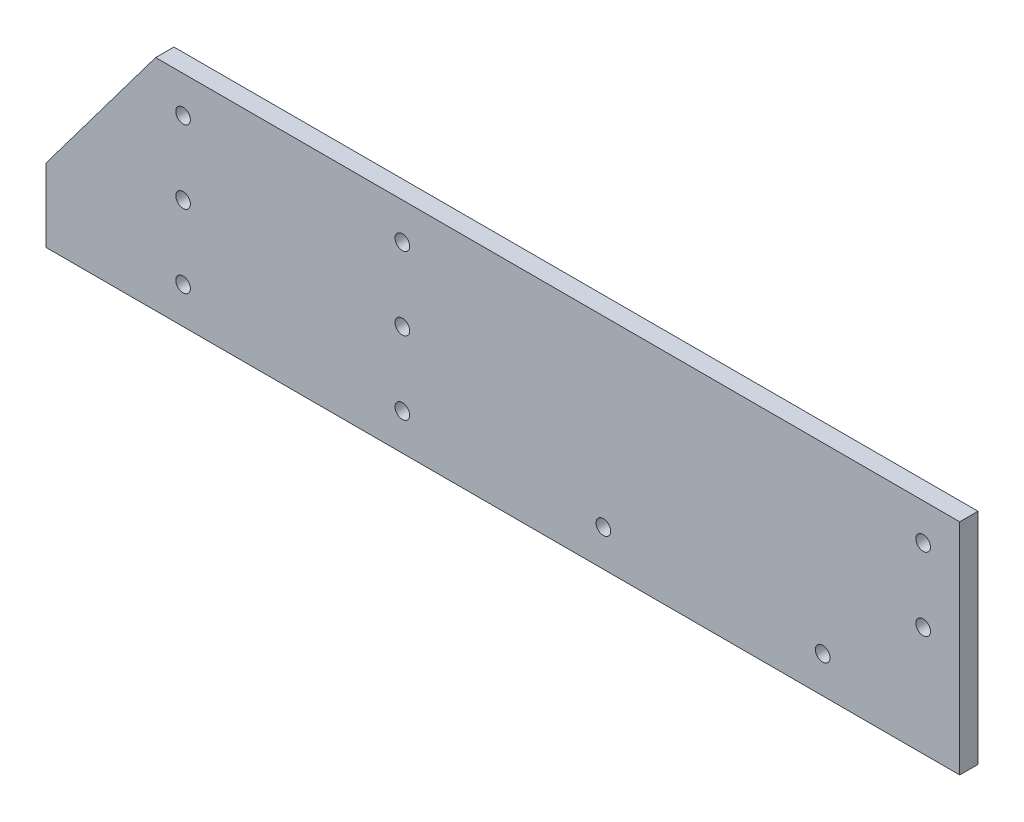
ISO-10303-21;
HEADER;
FILE_DESCRIPTION(('STEP AP214'),'2;1');
FILE_NAME('part.step','',(''),(''),'','','');
FILE_SCHEMA(('AUTOMOTIVE_DESIGN { 1 0 10303 214 1 1 1 1 }'));
ENDSEC;
DATA;
#1=APPLICATION_CONTEXT('core data for automotive mechanical design processes');
#2=APPLICATION_PROTOCOL_DEFINITION('international standard','automotive_design',2000,#1);
#3=PRODUCT_CONTEXT('',#1,'mechanical');
#4=PRODUCT('Part','Part','',(#3));
#5=PRODUCT_RELATED_PRODUCT_CATEGORY('part','',(#4));
#6=PRODUCT_DEFINITION_FORMATION('','',#4);
#7=PRODUCT_DEFINITION_CONTEXT('part definition',#1,'design');
#8=PRODUCT_DEFINITION('design','',#6,#7);
#9=PRODUCT_DEFINITION_SHAPE('','',#8);
#10=(LENGTH_UNIT() NAMED_UNIT(*) SI_UNIT(.MILLI.,.METRE.));
#11=(NAMED_UNIT(*) PLANE_ANGLE_UNIT() SI_UNIT($,.RADIAN.));
#12=(NAMED_UNIT(*) SI_UNIT($,.STERADIAN.) SOLID_ANGLE_UNIT());
#13=UNCERTAINTY_MEASURE_WITH_UNIT(LENGTH_MEASURE(1.E-05),#10,'distance_accuracy_value','');
#14=(GEOMETRIC_REPRESENTATION_CONTEXT(3) GLOBAL_UNCERTAINTY_ASSIGNED_CONTEXT((#13)) GLOBAL_UNIT_ASSIGNED_CONTEXT((#10,
#11,#12)) REPRESENTATION_CONTEXT('',''));
#15=CARTESIAN_POINT('',(0.,0.,0.));
#16=DIRECTION('',(0.,0.,1.));
#17=DIRECTION('',(1.,0.,0.));
#18=AXIS2_PLACEMENT_3D('',#15,#16,#17);
#19=CARTESIAN_POINT('',(0.,0.,5.));
#20=DIRECTION('',(1.,0.,0.));
#21=DIRECTION('',(0.,0.,-1.));
#22=AXIS2_PLACEMENT_3D('',#19,#20,#21);
#23=PLANE('',#22);
#24=DIRECTION('',(0.,-1.,0.));
#25=VECTOR('',#24,1.);
#26=CARTESIAN_POINT('',(0.,0.,5.));
#27=LINE('',#26,#25);
#28=CARTESIAN_POINT('',(0.,20.,5.));
#29=VERTEX_POINT('',#28);
#30=CARTESIAN_POINT('',(0.,0.,5.));
#31=VERTEX_POINT('',#30);
#32=EDGE_CURVE('E78',#29,#31,#27,.T.);
#33=ORIENTED_EDGE('',*,*,#32,.F.);
#34=DIRECTION('',(0.,0.,1.));
#35=VECTOR('',#34,1.);
#36=CARTESIAN_POINT('',(0.,20.,0.));
#37=LINE('',#36,#35);
#38=CARTESIAN_POINT('',(0.,20.,0.));
#39=VERTEX_POINT('',#38);
#40=EDGE_CURVE('E89',#39,#29,#37,.T.);
#41=ORIENTED_EDGE('',*,*,#40,.F.);
#42=DIRECTION('',(0.,-1.,0.));
#43=VECTOR('',#42,1.);
#44=CARTESIAN_POINT('',(0.,0.,0.));
#45=LINE('',#44,#43);
#46=CARTESIAN_POINT('',(0.,0.,0.));
#47=VERTEX_POINT('',#46);
#48=EDGE_CURVE('E97',#39,#47,#45,.T.);
#49=ORIENTED_EDGE('',*,*,#48,.T.);
#50=DIRECTION('',(0.,0.,-1.));
#51=VECTOR('',#50,1.);
#52=CARTESIAN_POINT('',(0.,0.,5.));
#53=LINE('',#52,#51);
#54=EDGE_CURVE('E11',#31,#47,#53,.T.);
#55=ORIENTED_EDGE('',*,*,#54,.F.);
#56=EDGE_LOOP('',(#33,#41,#49,#55));
#57=FACE_BOUND('',#56,.T.);
#58=ADVANCED_FACE('F33',(#57),#23,.F.);
#59=CARTESIAN_POINT('',(0.,0.,5.));
#60=DIRECTION('',(0.,1.,0.));
#61=DIRECTION('',(0.,0.,1.));
#62=AXIS2_PLACEMENT_3D('',#59,#60,#61);
#63=PLANE('',#62);
#64=DIRECTION('',(1.,0.,0.));
#65=VECTOR('',#64,1.);
#66=CARTESIAN_POINT('',(0.,0.,0.));
#67=LINE('',#66,#65);
#68=CARTESIAN_POINT('',(250.,0.,0.));
#69=VERTEX_POINT('',#68);
#70=EDGE_CURVE('E102',#47,#69,#67,.T.);
#71=ORIENTED_EDGE('',*,*,#70,.T.);
#72=DIRECTION('',(0.,0.,-1.));
#73=VECTOR('',#72,1.);
#74=CARTESIAN_POINT('',(250.,0.,5.));
#75=LINE('',#74,#73);
#76=CARTESIAN_POINT('',(250.,0.,5.));
#77=VERTEX_POINT('',#76);
#78=EDGE_CURVE('E40',#77,#69,#75,.T.);
#79=ORIENTED_EDGE('',*,*,#78,.F.);
#80=DIRECTION('',(1.,0.,0.));
#81=VECTOR('',#80,1.);
#82=CARTESIAN_POINT('',(0.,0.,5.));
#83=LINE('',#82,#81);
#84=EDGE_CURVE('E123',#31,#77,#83,.T.);
#85=ORIENTED_EDGE('',*,*,#84,.F.);
#86=ORIENTED_EDGE('',*,*,#54,.T.);
#87=EDGE_LOOP('',(#71,#79,#85,#86));
#88=FACE_BOUND('',#87,.T.);
#89=ADVANCED_FACE('F200',(#88),#63,.F.);
#90=CARTESIAN_POINT('',(250.,0.,5.));
#91=DIRECTION('',(-1.,0.,0.));
#92=DIRECTION('',(0.,0.,1.));
#93=AXIS2_PLACEMENT_3D('',#90,#91,#92);
#94=PLANE('',#93);
#95=DIRECTION('',(0.,1.,0.));
#96=VECTOR('',#95,1.);
#97=CARTESIAN_POINT('',(250.,0.,0.));
#98=LINE('',#97,#96);
#99=CARTESIAN_POINT('',(250.,60.,0.));
#100=VERTEX_POINT('',#99);
#101=EDGE_CURVE('E73',#69,#100,#98,.T.);
#102=ORIENTED_EDGE('',*,*,#101,.T.);
#103=DIRECTION('',(0.,0.,-1.));
#104=VECTOR('',#103,1.);
#105=CARTESIAN_POINT('',(250.,60.,5.));
#106=LINE('',#105,#104);
#107=CARTESIAN_POINT('',(250.,60.,5.));
#108=VERTEX_POINT('',#107);
#109=EDGE_CURVE('E116',#108,#100,#106,.T.);
#110=ORIENTED_EDGE('',*,*,#109,.F.);
#111=DIRECTION('',(0.,1.,0.));
#112=VECTOR('',#111,1.);
#113=CARTESIAN_POINT('',(250.,0.,5.));
#114=LINE('',#113,#112);
#115=EDGE_CURVE('E56',#77,#108,#114,.T.);
#116=ORIENTED_EDGE('',*,*,#115,.F.);
#117=ORIENTED_EDGE('',*,*,#78,.T.);
#118=EDGE_LOOP('',(#102,#110,#116,#117));
#119=FACE_BOUND('',#118,.T.);
#120=ADVANCED_FACE('F118',(#119),#94,.F.);
#121=CARTESIAN_POINT('',(0.,60.,5.));
#122=DIRECTION('',(0.,-1.,0.));
#123=DIRECTION('',(0.,0.,-1.));
#124=AXIS2_PLACEMENT_3D('',#121,#122,#123);
#125=PLANE('',#124);
#126=DIRECTION('',(-1.,0.,0.));
#127=VECTOR('',#126,1.);
#128=CARTESIAN_POINT('',(0.,60.,0.));
#129=LINE('',#128,#127);
#130=CARTESIAN_POINT('',(30.,60.,0.));
#131=VERTEX_POINT('',#130);
#132=EDGE_CURVE('E114',#100,#131,#129,.T.);
#133=ORIENTED_EDGE('',*,*,#132,.T.);
#134=DIRECTION('',(0.,0.,1.));
#135=VECTOR('',#134,1.);
#136=CARTESIAN_POINT('',(30.,60.,0.));
#137=LINE('',#136,#135);
#138=CARTESIAN_POINT('',(30.,60.,5.));
#139=VERTEX_POINT('',#138);
#140=EDGE_CURVE('E47',#131,#139,#137,.T.);
#141=ORIENTED_EDGE('',*,*,#140,.T.);
#142=DIRECTION('',(-1.,0.,0.));
#143=VECTOR('',#142,1.);
#144=CARTESIAN_POINT('',(0.,60.,5.));
#145=LINE('',#144,#143);
#146=EDGE_CURVE('E110',#108,#139,#145,.T.);
#147=ORIENTED_EDGE('',*,*,#146,.F.);
#148=ORIENTED_EDGE('',*,*,#109,.T.);
#149=EDGE_LOOP('',(#133,#141,#147,#148));
#150=FACE_BOUND('',#149,.T.);
#151=ADVANCED_FACE('F121',(#150),#125,.F.);
#152=CARTESIAN_POINT('',(0.,0.,5.));
#153=DIRECTION('',(0.,0.,-1.));
#154=DIRECTION('',(-1.,0.,0.));
#155=AXIS2_PLACEMENT_3D('',#152,#153,#154);
#156=PLANE('',#155);
#157=CARTESIAN_POINT('',(240.,30.,5.));
#158=DIRECTION('',(0.,0.,1.));
#159=DIRECTION('',(1.,0.,0.));
#160=AXIS2_PLACEMENT_3D('',#157,#158,#159);
#161=CIRCLE('',#160,2.);
#162=CARTESIAN_POINT('',(242.,30.,5.));
#163=VERTEX_POINT('',#162);
#164=EDGE_CURVE('E161',#163,#163,#161,.T.);
#165=ORIENTED_EDGE('',*,*,#164,.F.);
#166=EDGE_LOOP('',(#165));
#167=FACE_BOUND('',#166,.T.);
#168=CARTESIAN_POINT('',(37.5,30.,5.));
#169=DIRECTION('',(0.,0.,1.));
#170=DIRECTION('',(1.,0.,0.));
#171=AXIS2_PLACEMENT_3D('',#168,#169,#170);
#172=CIRCLE('',#171,2.);
#173=CARTESIAN_POINT('',(39.5,30.,5.));
#174=VERTEX_POINT('',#173);
#175=EDGE_CURVE('E154',#174,#174,#172,.T.);
#176=ORIENTED_EDGE('',*,*,#175,.F.);
#177=EDGE_LOOP('',(#176));
#178=FACE_BOUND('',#177,.T.);
#179=CARTESIAN_POINT('',(37.5,50.,5.));
#180=DIRECTION('',(0.,0.,1.));
#181=DIRECTION('',(1.,0.,0.));
#182=AXIS2_PLACEMENT_3D('',#179,#180,#181);
#183=CIRCLE('',#182,2.);
#184=CARTESIAN_POINT('',(39.5,50.,5.));
#185=VERTEX_POINT('',#184);
#186=EDGE_CURVE('E179',#185,#185,#183,.T.);
#187=ORIENTED_EDGE('',*,*,#186,.F.);
#188=EDGE_LOOP('',(#187));
#189=FACE_BOUND('',#188,.T.);
#190=CARTESIAN_POINT('',(97.5,50.,5.));
#191=DIRECTION('',(0.,0.,1.));
#192=DIRECTION('',(-1.,0.,0.));
#193=AXIS2_PLACEMENT_3D('',#190,#191,#192);
#194=CIRCLE('',#193,2.);
#195=CARTESIAN_POINT('',(95.5,50.,5.));
#196=VERTEX_POINT('',#195);
#197=EDGE_CURVE('E173',#196,#196,#194,.T.);
#198=ORIENTED_EDGE('',*,*,#197,.F.);
#199=EDGE_LOOP('',(#198));
#200=FACE_BOUND('',#199,.T.);
#201=CARTESIAN_POINT('',(97.5,30.,5.));
#202=DIRECTION('',(0.,0.,1.));
#203=DIRECTION('',(-1.,0.,0.));
#204=AXIS2_PLACEMENT_3D('',#201,#202,#203);
#205=CIRCLE('',#204,2.);
#206=CARTESIAN_POINT('',(95.5,30.,5.));
#207=VERTEX_POINT('',#206);
#208=EDGE_CURVE('E166',#207,#207,#205,.T.);
#209=ORIENTED_EDGE('',*,*,#208,.F.);
#210=EDGE_LOOP('',(#209));
#211=FACE_BOUND('',#210,.T.);
#212=CARTESIAN_POINT('',(240.,50.,5.));
#213=DIRECTION('',(0.,0.,1.));
#214=DIRECTION('',(1.,0.,0.));
#215=AXIS2_PLACEMENT_3D('',#212,#213,#214);
#216=CIRCLE('',#215,2.);
#217=CARTESIAN_POINT('',(242.,50.,5.));
#218=VERTEX_POINT('',#217);
#219=EDGE_CURVE('E130',#218,#218,#216,.T.);
#220=ORIENTED_EDGE('',*,*,#219,.F.);
#221=EDGE_LOOP('',(#220));
#222=FACE_BOUND('',#221,.T.);
#223=CARTESIAN_POINT('',(212.5,10.,5.));
#224=DIRECTION('',(0.,0.,1.));
#225=DIRECTION('',(-1.,0.,0.));
#226=AXIS2_PLACEMENT_3D('',#223,#224,#225);
#227=CIRCLE('',#226,2.);
#228=CARTESIAN_POINT('',(210.5,10.,5.));
#229=VERTEX_POINT('',#228);
#230=EDGE_CURVE('E137',#229,#229,#227,.T.);
#231=ORIENTED_EDGE('',*,*,#230,.F.);
#232=EDGE_LOOP('',(#231));
#233=FACE_BOUND('',#232,.T.);
#234=CARTESIAN_POINT('',(152.5,10.,5.));
#235=DIRECTION('',(0.,0.,1.));
#236=DIRECTION('',(-1.,0.,0.));
#237=AXIS2_PLACEMENT_3D('',#234,#235,#236);
#238=CIRCLE('',#237,2.);
#239=CARTESIAN_POINT('',(150.5,10.,5.));
#240=VERTEX_POINT('',#239);
#241=EDGE_CURVE('E143',#240,#240,#238,.T.);
#242=ORIENTED_EDGE('',*,*,#241,.F.);
#243=EDGE_LOOP('',(#242));
#244=FACE_BOUND('',#243,.T.);
#245=CARTESIAN_POINT('',(97.5,10.,5.));
#246=DIRECTION('',(0.,0.,1.));
#247=DIRECTION('',(1.,0.,0.));
#248=AXIS2_PLACEMENT_3D('',#245,#246,#247);
#249=CIRCLE('',#248,2.);
#250=CARTESIAN_POINT('',(99.5,10.,5.));
#251=VERTEX_POINT('',#250);
#252=EDGE_CURVE('E149',#251,#251,#249,.T.);
#253=ORIENTED_EDGE('',*,*,#252,.F.);
#254=EDGE_LOOP('',(#253));
#255=FACE_BOUND('',#254,.T.);
#256=CARTESIAN_POINT('',(37.5,10.,5.));
#257=DIRECTION('',(0.,0.,1.));
#258=DIRECTION('',(1.,0.,0.));
#259=AXIS2_PLACEMENT_3D('',#256,#257,#258);
#260=CIRCLE('',#259,2.);
#261=CARTESIAN_POINT('',(39.5,10.,5.));
#262=VERTEX_POINT('',#261);
#263=EDGE_CURVE('E107',#262,#262,#260,.T.);
#264=ORIENTED_EDGE('',*,*,#263,.F.);
#265=EDGE_LOOP('',(#264));
#266=FACE_BOUND('',#265,.T.);
#267=ORIENTED_EDGE('',*,*,#146,.T.);
#268=DIRECTION('',(-0.6,-0.8,0.));
#269=VECTOR('',#268,1.);
#270=CARTESIAN_POINT('',(-9.6,7.2,5.));
#271=LINE('',#270,#269);
#272=EDGE_CURVE('E170',#139,#29,#271,.T.);
#273=ORIENTED_EDGE('',*,*,#272,.T.);
#274=ORIENTED_EDGE('',*,*,#32,.T.);
#275=ORIENTED_EDGE('',*,*,#84,.T.);
#276=ORIENTED_EDGE('',*,*,#115,.T.);
#277=EDGE_LOOP('',(#267,#273,#274,#275,#276));
#278=FACE_BOUND('',#277,.T.);
#279=ADVANCED_FACE('F185',(#167,#178,#189,#200,#211,#222,#233,#244,#255,#266,#278),#156,.F.);
#280=CARTESIAN_POINT('',(0.,0.,0.));
#281=DIRECTION('',(0.,0.,-1.));
#282=DIRECTION('',(-1.,0.,0.));
#283=AXIS2_PLACEMENT_3D('',#280,#281,#282);
#284=PLANE('',#283);
#285=DIRECTION('',(0.6,0.8,0.));
#286=VECTOR('',#285,1.);
#287=CARTESIAN_POINT('',(0.,20.,0.));
#288=LINE('',#287,#286);
#289=EDGE_CURVE('E86',#39,#131,#288,.T.);
#290=ORIENTED_EDGE('',*,*,#289,.T.);
#291=ORIENTED_EDGE('',*,*,#132,.F.);
#292=ORIENTED_EDGE('',*,*,#101,.F.);
#293=ORIENTED_EDGE('',*,*,#70,.F.);
#294=ORIENTED_EDGE('',*,*,#48,.F.);
#295=EDGE_LOOP('',(#290,#291,#292,#293,#294));
#296=FACE_BOUND('',#295,.T.);
#297=CARTESIAN_POINT('',(240.,30.,0.));
#298=DIRECTION('',(0.,0.,1.));
#299=DIRECTION('',(1.,0.,0.));
#300=AXIS2_PLACEMENT_3D('',#297,#298,#299);
#301=CIRCLE('',#300,2.);
#302=CARTESIAN_POINT('',(242.,30.,0.));
#303=VERTEX_POINT('',#302);
#304=EDGE_CURVE('E134',#303,#303,#301,.T.);
#305=ORIENTED_EDGE('',*,*,#304,.T.);
#306=EDGE_LOOP('',(#305));
#307=FACE_BOUND('',#306,.T.);
#308=CARTESIAN_POINT('',(37.5,30.,0.));
#309=DIRECTION('',(0.,0.,1.));
#310=DIRECTION('',(1.,0.,0.));
#311=AXIS2_PLACEMENT_3D('',#308,#309,#310);
#312=CIRCLE('',#311,2.);
#313=CARTESIAN_POINT('',(39.5,30.,0.));
#314=VERTEX_POINT('',#313);
#315=EDGE_CURVE('E157',#314,#314,#312,.T.);
#316=ORIENTED_EDGE('',*,*,#315,.T.);
#317=EDGE_LOOP('',(#316));
#318=FACE_BOUND('',#317,.T.);
#319=CARTESIAN_POINT('',(37.5,50.,0.));
#320=DIRECTION('',(0.,0.,1.));
#321=DIRECTION('',(1.,0.,0.));
#322=AXIS2_PLACEMENT_3D('',#319,#320,#321);
#323=CIRCLE('',#322,2.);
#324=CARTESIAN_POINT('',(39.5,50.,0.));
#325=VERTEX_POINT('',#324);
#326=EDGE_CURVE('E158',#325,#325,#323,.T.);
#327=ORIENTED_EDGE('',*,*,#326,.T.);
#328=EDGE_LOOP('',(#327));
#329=FACE_BOUND('',#328,.T.);
#330=CARTESIAN_POINT('',(97.5,50.,0.));
#331=DIRECTION('',(0.,0.,1.));
#332=DIRECTION('',(-1.,0.,0.));
#333=AXIS2_PLACEMENT_3D('',#330,#331,#332);
#334=CIRCLE('',#333,2.);
#335=CARTESIAN_POINT('',(95.5,50.,0.));
#336=VERTEX_POINT('',#335);
#337=EDGE_CURVE('E176',#336,#336,#334,.T.);
#338=ORIENTED_EDGE('',*,*,#337,.T.);
#339=EDGE_LOOP('',(#338));
#340=FACE_BOUND('',#339,.T.);
#341=CARTESIAN_POINT('',(97.5,30.,0.));
#342=DIRECTION('',(0.,0.,1.));
#343=DIRECTION('',(-1.,0.,0.));
#344=AXIS2_PLACEMENT_3D('',#341,#342,#343);
#345=CIRCLE('',#344,2.);
#346=CARTESIAN_POINT('',(95.5,30.,0.));
#347=VERTEX_POINT('',#346);
#348=EDGE_CURVE('E169',#347,#347,#345,.T.);
#349=ORIENTED_EDGE('',*,*,#348,.T.);
#350=EDGE_LOOP('',(#349));
#351=FACE_BOUND('',#350,.T.);
#352=CARTESIAN_POINT('',(240.,50.,0.));
#353=DIRECTION('',(0.,0.,1.));
#354=DIRECTION('',(1.,0.,0.));
#355=AXIS2_PLACEMENT_3D('',#352,#353,#354);
#356=CIRCLE('',#355,2.);
#357=CARTESIAN_POINT('',(242.,50.,0.));
#358=VERTEX_POINT('',#357);
#359=EDGE_CURVE('E133',#358,#358,#356,.T.);
#360=ORIENTED_EDGE('',*,*,#359,.T.);
#361=EDGE_LOOP('',(#360));
#362=FACE_BOUND('',#361,.T.);
#363=CARTESIAN_POINT('',(212.5,10.,0.));
#364=DIRECTION('',(0.,0.,1.));
#365=DIRECTION('',(-1.,0.,0.));
#366=AXIS2_PLACEMENT_3D('',#363,#364,#365);
#367=CIRCLE('',#366,2.);
#368=CARTESIAN_POINT('',(210.5,10.,0.));
#369=VERTEX_POINT('',#368);
#370=EDGE_CURVE('E140',#369,#369,#367,.T.);
#371=ORIENTED_EDGE('',*,*,#370,.T.);
#372=EDGE_LOOP('',(#371));
#373=FACE_BOUND('',#372,.T.);
#374=CARTESIAN_POINT('',(152.5,10.,0.));
#375=DIRECTION('',(0.,0.,1.));
#376=DIRECTION('',(-1.,0.,0.));
#377=AXIS2_PLACEMENT_3D('',#374,#375,#376);
#378=CIRCLE('',#377,2.);
#379=CARTESIAN_POINT('',(150.5,10.,0.));
#380=VERTEX_POINT('',#379);
#381=EDGE_CURVE('E146',#380,#380,#378,.T.);
#382=ORIENTED_EDGE('',*,*,#381,.T.);
#383=EDGE_LOOP('',(#382));
#384=FACE_BOUND('',#383,.T.);
#385=CARTESIAN_POINT('',(97.5,10.,0.));
#386=DIRECTION('',(0.,0.,1.));
#387=DIRECTION('',(1.,0.,0.));
#388=AXIS2_PLACEMENT_3D('',#385,#386,#387);
#389=CIRCLE('',#388,2.);
#390=CARTESIAN_POINT('',(99.5,10.,0.));
#391=VERTEX_POINT('',#390);
#392=EDGE_CURVE('E128',#391,#391,#389,.T.);
#393=ORIENTED_EDGE('',*,*,#392,.T.);
#394=EDGE_LOOP('',(#393));
#395=FACE_BOUND('',#394,.T.);
#396=CARTESIAN_POINT('',(37.5,10.,0.));
#397=DIRECTION('',(0.,0.,1.));
#398=DIRECTION('',(1.,0.,0.));
#399=AXIS2_PLACEMENT_3D('',#396,#397,#398);
#400=CIRCLE('',#399,2.);
#401=CARTESIAN_POINT('',(39.5,10.,0.));
#402=VERTEX_POINT('',#401);
#403=EDGE_CURVE('E103',#402,#402,#400,.T.);
#404=ORIENTED_EDGE('',*,*,#403,.T.);
#405=EDGE_LOOP('',(#404));
#406=FACE_BOUND('',#405,.T.);
#407=ADVANCED_FACE('F100',(#296,#307,#318,#329,#340,#351,#362,#373,#384,#395,#406),#284,.T.);
#408=CARTESIAN_POINT('',(37.5,10.,0.));
#409=DIRECTION('',(0.,0.,1.));
#410=DIRECTION('',(1.,0.,0.));
#411=AXIS2_PLACEMENT_3D('',#408,#409,#410);
#412=CYLINDRICAL_SURFACE('',#411,2.);
#413=ORIENTED_EDGE('',*,*,#403,.F.);
#414=EDGE_LOOP('',(#413));
#415=FACE_BOUND('',#414,.T.);
#416=ORIENTED_EDGE('',*,*,#263,.T.);
#417=EDGE_LOOP('',(#416));
#418=FACE_BOUND('',#417,.T.);
#419=ADVANCED_FACE('F193',(#415,#418),#412,.F.);
#420=CARTESIAN_POINT('',(97.5,10.,0.));
#421=DIRECTION('',(0.,0.,1.));
#422=DIRECTION('',(1.,0.,0.));
#423=AXIS2_PLACEMENT_3D('',#420,#421,#422);
#424=CYLINDRICAL_SURFACE('',#423,2.);
#425=ORIENTED_EDGE('',*,*,#392,.F.);
#426=EDGE_LOOP('',(#425));
#427=FACE_BOUND('',#426,.T.);
#428=ORIENTED_EDGE('',*,*,#252,.T.);
#429=EDGE_LOOP('',(#428));
#430=FACE_BOUND('',#429,.T.);
#431=ADVANCED_FACE('F302',(#427,#430),#424,.F.);
#432=CARTESIAN_POINT('',(152.5,10.,0.));
#433=DIRECTION('',(0.,0.,1.));
#434=DIRECTION('',(1.,0.,0.));
#435=AXIS2_PLACEMENT_3D('',#432,#433,#434);
#436=CYLINDRICAL_SURFACE('',#435,2.);
#437=ORIENTED_EDGE('',*,*,#381,.F.);
#438=EDGE_LOOP('',(#437));
#439=FACE_BOUND('',#438,.T.);
#440=ORIENTED_EDGE('',*,*,#241,.T.);
#441=EDGE_LOOP('',(#440));
#442=FACE_BOUND('',#441,.T.);
#443=ADVANCED_FACE('F294',(#439,#442),#436,.F.);
#444=CARTESIAN_POINT('',(212.5,10.,0.));
#445=DIRECTION('',(0.,0.,1.));
#446=DIRECTION('',(1.,0.,0.));
#447=AXIS2_PLACEMENT_3D('',#444,#445,#446);
#448=CYLINDRICAL_SURFACE('',#447,2.);
#449=ORIENTED_EDGE('',*,*,#370,.F.);
#450=EDGE_LOOP('',(#449));
#451=FACE_BOUND('',#450,.T.);
#452=ORIENTED_EDGE('',*,*,#230,.T.);
#453=EDGE_LOOP('',(#452));
#454=FACE_BOUND('',#453,.T.);
#455=ADVANCED_FACE('F286',(#451,#454),#448,.F.);
#456=CARTESIAN_POINT('',(240.,50.,0.));
#457=DIRECTION('',(0.,0.,1.));
#458=DIRECTION('',(1.,0.,0.));
#459=AXIS2_PLACEMENT_3D('',#456,#457,#458);
#460=CYLINDRICAL_SURFACE('',#459,2.);
#461=ORIENTED_EDGE('',*,*,#359,.F.);
#462=EDGE_LOOP('',(#461));
#463=FACE_BOUND('',#462,.T.);
#464=ORIENTED_EDGE('',*,*,#219,.T.);
#465=EDGE_LOOP('',(#464));
#466=FACE_BOUND('',#465,.T.);
#467=ADVANCED_FACE('F278',(#463,#466),#460,.F.);
#468=CARTESIAN_POINT('',(97.5,30.,0.));
#469=DIRECTION('',(0.,0.,1.));
#470=DIRECTION('',(1.,0.,0.));
#471=AXIS2_PLACEMENT_3D('',#468,#469,#470);
#472=CYLINDRICAL_SURFACE('',#471,2.);
#473=ORIENTED_EDGE('',*,*,#348,.F.);
#474=EDGE_LOOP('',(#473));
#475=FACE_BOUND('',#474,.T.);
#476=ORIENTED_EDGE('',*,*,#208,.T.);
#477=EDGE_LOOP('',(#476));
#478=FACE_BOUND('',#477,.T.);
#479=ADVANCED_FACE('F270',(#475,#478),#472,.F.);
#480=CARTESIAN_POINT('',(97.5,50.,0.));
#481=DIRECTION('',(0.,0.,1.));
#482=DIRECTION('',(1.,0.,0.));
#483=AXIS2_PLACEMENT_3D('',#480,#481,#482);
#484=CYLINDRICAL_SURFACE('',#483,2.);
#485=ORIENTED_EDGE('',*,*,#337,.F.);
#486=EDGE_LOOP('',(#485));
#487=FACE_BOUND('',#486,.T.);
#488=ORIENTED_EDGE('',*,*,#197,.T.);
#489=EDGE_LOOP('',(#488));
#490=FACE_BOUND('',#489,.T.);
#491=ADVANCED_FACE('F262',(#487,#490),#484,.F.);
#492=CARTESIAN_POINT('',(37.5,50.,0.));
#493=DIRECTION('',(0.,0.,1.));
#494=DIRECTION('',(1.,0.,0.));
#495=AXIS2_PLACEMENT_3D('',#492,#493,#494);
#496=CYLINDRICAL_SURFACE('',#495,2.);
#497=ORIENTED_EDGE('',*,*,#326,.F.);
#498=EDGE_LOOP('',(#497));
#499=FACE_BOUND('',#498,.T.);
#500=ORIENTED_EDGE('',*,*,#186,.T.);
#501=EDGE_LOOP('',(#500));
#502=FACE_BOUND('',#501,.T.);
#503=ADVANCED_FACE('F254',(#499,#502),#496,.F.);
#504=CARTESIAN_POINT('',(37.5,30.,0.));
#505=DIRECTION('',(0.,0.,1.));
#506=DIRECTION('',(1.,0.,0.));
#507=AXIS2_PLACEMENT_3D('',#504,#505,#506);
#508=CYLINDRICAL_SURFACE('',#507,2.);
#509=ORIENTED_EDGE('',*,*,#315,.F.);
#510=EDGE_LOOP('',(#509));
#511=FACE_BOUND('',#510,.T.);
#512=ORIENTED_EDGE('',*,*,#175,.T.);
#513=EDGE_LOOP('',(#512));
#514=FACE_BOUND('',#513,.T.);
#515=ADVANCED_FACE('F247',(#511,#514),#508,.F.);
#516=CARTESIAN_POINT('',(240.,30.,0.));
#517=DIRECTION('',(0.,0.,1.));
#518=DIRECTION('',(1.,0.,0.));
#519=AXIS2_PLACEMENT_3D('',#516,#517,#518);
#520=CYLINDRICAL_SURFACE('',#519,2.);
#521=ORIENTED_EDGE('',*,*,#304,.F.);
#522=EDGE_LOOP('',(#521));
#523=FACE_BOUND('',#522,.T.);
#524=ORIENTED_EDGE('',*,*,#164,.T.);
#525=EDGE_LOOP('',(#524));
#526=FACE_BOUND('',#525,.T.);
#527=ADVANCED_FACE('F238',(#523,#526),#520,.F.);
#528=CARTESIAN_POINT('',(0.,20.,0.));
#529=DIRECTION('',(0.8,-0.6,0.));
#530=DIRECTION('',(0.6,0.8,0.));
#531=AXIS2_PLACEMENT_3D('',#528,#529,#530);
#532=PLANE('',#531);
#533=ORIENTED_EDGE('',*,*,#140,.F.);
#534=ORIENTED_EDGE('',*,*,#289,.F.);
#535=ORIENTED_EDGE('',*,*,#40,.T.);
#536=ORIENTED_EDGE('',*,*,#272,.F.);
#537=EDGE_LOOP('',(#533,#534,#535,#536));
#538=FACE_BOUND('',#537,.T.);
#539=ADVANCED_FACE('F88',(#538),#532,.F.);
#540=CLOSED_SHELL('',(#58,#89,#120,#151,#279,#407,#419,#431,#443,#455,#467,#479,#491,#503,#515,
#527,#539));
#541=MANIFOLD_SOLID_BREP('B2',#540);
#542=ADVANCED_BREP_SHAPE_REPRESENTATION('',(#18,#541),#14);
#543=SHAPE_DEFINITION_REPRESENTATION(#9,#542);
ENDSEC;
END-ISO-10303-21;
